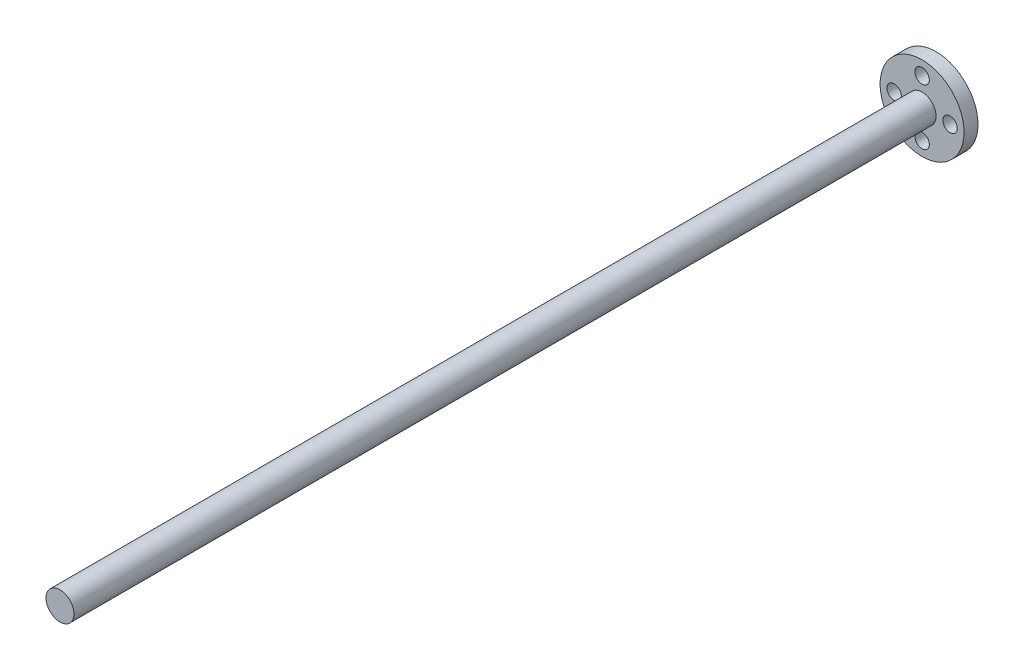
ISO-10303-21;
HEADER;
FILE_DESCRIPTION(('STEP AP214'),'2;1');
FILE_NAME('part.step','',(''),(''),'','','');
FILE_SCHEMA(('AUTOMOTIVE_DESIGN { 1 0 10303 214 1 1 1 1 }'));
ENDSEC;
DATA;
#1=APPLICATION_CONTEXT('core data for automotive mechanical design processes');
#2=APPLICATION_PROTOCOL_DEFINITION('international standard','automotive_design',2000,#1);
#3=PRODUCT_CONTEXT('',#1,'mechanical');
#4=PRODUCT('Part','Part','',(#3));
#5=PRODUCT_RELATED_PRODUCT_CATEGORY('part','',(#4));
#6=PRODUCT_DEFINITION_FORMATION('','',#4);
#7=PRODUCT_DEFINITION_CONTEXT('part definition',#1,'design');
#8=PRODUCT_DEFINITION('design','',#6,#7);
#9=PRODUCT_DEFINITION_SHAPE('','',#8);
#10=(LENGTH_UNIT() NAMED_UNIT(*) SI_UNIT(.MILLI.,.METRE.));
#11=(NAMED_UNIT(*) PLANE_ANGLE_UNIT() SI_UNIT($,.RADIAN.));
#12=(NAMED_UNIT(*) SI_UNIT($,.STERADIAN.) SOLID_ANGLE_UNIT());
#13=UNCERTAINTY_MEASURE_WITH_UNIT(LENGTH_MEASURE(1.E-05),#10,'distance_accuracy_value','');
#14=(GEOMETRIC_REPRESENTATION_CONTEXT(3) GLOBAL_UNCERTAINTY_ASSIGNED_CONTEXT((#13)) GLOBAL_UNIT_ASSIGNED_CONTEXT((#10,
#11,#12)) REPRESENTATION_CONTEXT('',''));
#15=CARTESIAN_POINT('',(0.,0.,0.));
#16=DIRECTION('',(0.,0.,1.));
#17=DIRECTION('',(1.,0.,0.));
#18=AXIS2_PLACEMENT_3D('',#15,#16,#17);
#19=CARTESIAN_POINT('',(0.,0.,3.));
#20=DIRECTION('',(0.,0.,1.));
#21=DIRECTION('',(1.,0.,0.));
#22=AXIS2_PLACEMENT_3D('',#19,#20,#21);
#23=PLANE('',#22);
#24=CARTESIAN_POINT('',(0.,0.,3.));
#25=DIRECTION('',(0.,0.,1.));
#26=DIRECTION('',(1.,0.,0.));
#27=AXIS2_PLACEMENT_3D('',#24,#25,#26);
#28=CIRCLE('',#27,3.);
#29=CARTESIAN_POINT('',(3.,0.,3.));
#30=VERTEX_POINT('',#29);
#31=EDGE_CURVE('E84',#30,#30,#28,.T.);
#32=ORIENTED_EDGE('',*,*,#31,.F.);
#33=EDGE_LOOP('',(#32));
#34=FACE_BOUND('',#33,.T.);
#35=CARTESIAN_POINT('',(6.,0.,3.));
#36=DIRECTION('',(0.,0.,1.));
#37=DIRECTION('',(1.,0.,0.));
#38=AXIS2_PLACEMENT_3D('',#35,#36,#37);
#39=CIRCLE('',#38,1.55);
#40=CARTESIAN_POINT('',(7.55,0.,3.));
#41=VERTEX_POINT('',#40);
#42=EDGE_CURVE('E64',#41,#41,#39,.T.);
#43=ORIENTED_EDGE('',*,*,#42,.F.);
#44=EDGE_LOOP('',(#43));
#45=FACE_BOUND('',#44,.T.);
#46=CARTESIAN_POINT('',(-6.,0.,3.));
#47=DIRECTION('',(0.,0.,1.));
#48=DIRECTION('',(1.,0.,0.));
#49=AXIS2_PLACEMENT_3D('',#46,#47,#48);
#50=CIRCLE('',#49,1.55);
#51=CARTESIAN_POINT('',(-4.45,0.,3.));
#52=VERTEX_POINT('',#51);
#53=EDGE_CURVE('E50',#52,#52,#50,.T.);
#54=ORIENTED_EDGE('',*,*,#53,.F.);
#55=EDGE_LOOP('',(#54));
#56=FACE_BOUND('',#55,.T.);
#57=CARTESIAN_POINT('',(0.,0.,3.));
#58=DIRECTION('',(0.,0.,1.));
#59=DIRECTION('',(1.,0.,0.));
#60=AXIS2_PLACEMENT_3D('',#57,#58,#59);
#61=CIRCLE('',#60,9.);
#62=CARTESIAN_POINT('',(9.,0.,3.));
#63=VERTEX_POINT('',#62);
#64=EDGE_CURVE('E10',#63,#63,#61,.T.);
#65=ORIENTED_EDGE('',*,*,#64,.T.);
#66=EDGE_LOOP('',(#65));
#67=FACE_BOUND('',#66,.T.);
#68=CARTESIAN_POINT('',(0.,6.,3.));
#69=DIRECTION('',(0.,0.,1.));
#70=DIRECTION('',(1.,0.,0.));
#71=AXIS2_PLACEMENT_3D('',#68,#69,#70);
#72=CIRCLE('',#71,1.55);
#73=CARTESIAN_POINT('',(1.55000000000002,6.,3.));
#74=VERTEX_POINT('',#73);
#75=EDGE_CURVE('E56',#74,#74,#72,.T.);
#76=ORIENTED_EDGE('',*,*,#75,.F.);
#77=EDGE_LOOP('',(#76));
#78=FACE_BOUND('',#77,.T.);
#79=CARTESIAN_POINT('',(0.,-6.,3.));
#80=DIRECTION('',(0.,0.,1.));
#81=DIRECTION('',(1.,0.,0.));
#82=AXIS2_PLACEMENT_3D('',#79,#80,#81);
#83=CIRCLE('',#82,1.55);
#84=CARTESIAN_POINT('',(1.54999999999994,-6.,3.));
#85=VERTEX_POINT('',#84);
#86=EDGE_CURVE('E72',#85,#85,#83,.T.);
#87=ORIENTED_EDGE('',*,*,#86,.F.);
#88=EDGE_LOOP('',(#87));
#89=FACE_BOUND('',#88,.T.);
#90=ADVANCED_FACE('F37',(#34,#45,#56,#67,#78,#89),#23,.T.);
#91=CARTESIAN_POINT('',(0.,0.,0.));
#92=DIRECTION('',(0.,0.,1.));
#93=DIRECTION('',(1.,0.,0.));
#94=AXIS2_PLACEMENT_3D('',#91,#92,#93);
#95=PLANE('',#94);
#96=CARTESIAN_POINT('',(0.,0.,0.));
#97=DIRECTION('',(0.,0.,1.));
#98=DIRECTION('',(1.,0.,0.));
#99=AXIS2_PLACEMENT_3D('',#96,#97,#98);
#100=CIRCLE('',#99,9.);
#101=CARTESIAN_POINT('',(9.,0.,0.));
#102=VERTEX_POINT('',#101);
#103=EDGE_CURVE('E41',#102,#102,#100,.T.);
#104=ORIENTED_EDGE('',*,*,#103,.F.);
#105=EDGE_LOOP('',(#104));
#106=FACE_BOUND('',#105,.T.);
#107=CARTESIAN_POINT('',(-6.,0.,0.));
#108=DIRECTION('',(0.,0.,1.));
#109=DIRECTION('',(1.,0.,0.));
#110=AXIS2_PLACEMENT_3D('',#107,#108,#109);
#111=CIRCLE('',#110,1.55);
#112=CARTESIAN_POINT('',(-4.45,0.,0.));
#113=VERTEX_POINT('',#112);
#114=EDGE_CURVE('E52',#113,#113,#111,.T.);
#115=ORIENTED_EDGE('',*,*,#114,.T.);
#116=EDGE_LOOP('',(#115));
#117=FACE_BOUND('',#116,.T.);
#118=CARTESIAN_POINT('',(0.,6.,0.));
#119=DIRECTION('',(0.,0.,1.));
#120=DIRECTION('',(1.,0.,0.));
#121=AXIS2_PLACEMENT_3D('',#118,#119,#120);
#122=CIRCLE('',#121,1.55);
#123=CARTESIAN_POINT('',(1.55000000000002,6.,0.));
#124=VERTEX_POINT('',#123);
#125=EDGE_CURVE('E60',#124,#124,#122,.T.);
#126=ORIENTED_EDGE('',*,*,#125,.T.);
#127=EDGE_LOOP('',(#126));
#128=FACE_BOUND('',#127,.T.);
#129=CARTESIAN_POINT('',(6.,0.,0.));
#130=DIRECTION('',(0.,0.,1.));
#131=DIRECTION('',(1.,0.,0.));
#132=AXIS2_PLACEMENT_3D('',#129,#130,#131);
#133=CIRCLE('',#132,1.55);
#134=CARTESIAN_POINT('',(7.55,0.,0.));
#135=VERTEX_POINT('',#134);
#136=EDGE_CURVE('E68',#135,#135,#133,.T.);
#137=ORIENTED_EDGE('',*,*,#136,.T.);
#138=EDGE_LOOP('',(#137));
#139=FACE_BOUND('',#138,.T.);
#140=CARTESIAN_POINT('',(0.,-6.,0.));
#141=DIRECTION('',(0.,0.,1.));
#142=DIRECTION('',(1.,0.,0.));
#143=AXIS2_PLACEMENT_3D('',#140,#141,#142);
#144=CIRCLE('',#143,1.55);
#145=CARTESIAN_POINT('',(1.54999999999994,-6.,0.));
#146=VERTEX_POINT('',#145);
#147=EDGE_CURVE('E76',#146,#146,#144,.T.);
#148=ORIENTED_EDGE('',*,*,#147,.T.);
#149=EDGE_LOOP('',(#148));
#150=FACE_BOUND('',#149,.T.);
#151=ADVANCED_FACE('F103',(#106,#117,#128,#139,#150),#95,.F.);
#152=CARTESIAN_POINT('',(0.,0.,3.));
#153=DIRECTION('',(0.,0.,-1.));
#154=DIRECTION('',(-1.,0.,0.));
#155=AXIS2_PLACEMENT_3D('',#152,#153,#154);
#156=CYLINDRICAL_SURFACE('',#155,9.);
#157=ORIENTED_EDGE('',*,*,#64,.F.);
#158=EDGE_LOOP('',(#157));
#159=FACE_BOUND('',#158,.T.);
#160=ORIENTED_EDGE('',*,*,#103,.T.);
#161=EDGE_LOOP('',(#160));
#162=FACE_BOUND('',#161,.T.);
#163=ADVANCED_FACE('F39',(#159,#162),#156,.T.);
#164=CARTESIAN_POINT('',(-6.,0.,3.));
#165=DIRECTION('',(0.,0.,-1.));
#166=DIRECTION('',(-1.,0.,0.));
#167=AXIS2_PLACEMENT_3D('',#164,#165,#166);
#168=CYLINDRICAL_SURFACE('',#167,1.55);
#169=ORIENTED_EDGE('',*,*,#53,.T.);
#170=EDGE_LOOP('',(#169));
#171=FACE_BOUND('',#170,.T.);
#172=ORIENTED_EDGE('',*,*,#114,.F.);
#173=EDGE_LOOP('',(#172));
#174=FACE_BOUND('',#173,.T.);
#175=ADVANCED_FACE('F124',(#171,#174),#168,.F.);
#176=CARTESIAN_POINT('',(0.,6.,3.));
#177=DIRECTION('',(0.,0.,-1.));
#178=DIRECTION('',(-1.,0.,0.));
#179=AXIS2_PLACEMENT_3D('',#176,#177,#178);
#180=CYLINDRICAL_SURFACE('',#179,1.55);
#181=ORIENTED_EDGE('',*,*,#75,.T.);
#182=EDGE_LOOP('',(#181));
#183=FACE_BOUND('',#182,.T.);
#184=ORIENTED_EDGE('',*,*,#125,.F.);
#185=EDGE_LOOP('',(#184));
#186=FACE_BOUND('',#185,.T.);
#187=ADVANCED_FACE('F131',(#183,#186),#180,.F.);
#188=CARTESIAN_POINT('',(6.,0.,3.));
#189=DIRECTION('',(0.,0.,-1.));
#190=DIRECTION('',(-1.,0.,0.));
#191=AXIS2_PLACEMENT_3D('',#188,#189,#190);
#192=CYLINDRICAL_SURFACE('',#191,1.55);
#193=ORIENTED_EDGE('',*,*,#42,.T.);
#194=EDGE_LOOP('',(#193));
#195=FACE_BOUND('',#194,.T.);
#196=ORIENTED_EDGE('',*,*,#136,.F.);
#197=EDGE_LOOP('',(#196));
#198=FACE_BOUND('',#197,.T.);
#199=ADVANCED_FACE('F115',(#195,#198),#192,.F.);
#200=CARTESIAN_POINT('',(0.,-6.,3.));
#201=DIRECTION('',(0.,0.,-1.));
#202=DIRECTION('',(-1.,0.,0.));
#203=AXIS2_PLACEMENT_3D('',#200,#201,#202);
#204=CYLINDRICAL_SURFACE('',#203,1.55);
#205=ORIENTED_EDGE('',*,*,#86,.T.);
#206=EDGE_LOOP('',(#205));
#207=FACE_BOUND('',#206,.T.);
#208=ORIENTED_EDGE('',*,*,#147,.F.);
#209=EDGE_LOOP('',(#208));
#210=FACE_BOUND('',#209,.T.);
#211=ADVANCED_FACE('F97',(#207,#210),#204,.F.);
#212=CARTESIAN_POINT('',(0.,0.,188.));
#213=DIRECTION('',(0.,0.,-1.));
#214=DIRECTION('',(-1.,0.,0.));
#215=AXIS2_PLACEMENT_3D('',#212,#213,#214);
#216=CYLINDRICAL_SURFACE('',#215,3.);
#217=CARTESIAN_POINT('',(0.,0.,188.));
#218=DIRECTION('',(0.,0.,1.));
#219=DIRECTION('',(1.,0.,0.));
#220=AXIS2_PLACEMENT_3D('',#217,#218,#219);
#221=CIRCLE('',#220,3.);
#222=CARTESIAN_POINT('',(3.,0.,188.));
#223=VERTEX_POINT('',#222);
#224=EDGE_CURVE('E80',#223,#223,#221,.T.);
#225=ORIENTED_EDGE('',*,*,#224,.F.);
#226=EDGE_LOOP('',(#225));
#227=FACE_BOUND('',#226,.T.);
#228=ORIENTED_EDGE('',*,*,#31,.T.);
#229=EDGE_LOOP('',(#228));
#230=FACE_BOUND('',#229,.T.);
#231=ADVANCED_FACE('F94',(#227,#230),#216,.T.);
#232=CARTESIAN_POINT('',(0.,0.,188.));
#233=DIRECTION('',(0.,0.,1.));
#234=DIRECTION('',(1.,0.,0.));
#235=AXIS2_PLACEMENT_3D('',#232,#233,#234);
#236=PLANE('',#235);
#237=ORIENTED_EDGE('',*,*,#224,.T.);
#238=EDGE_LOOP('',(#237));
#239=FACE_BOUND('',#238,.T.);
#240=ADVANCED_FACE('F92',(#239),#236,.T.);
#241=CLOSED_SHELL('',(#90,#151,#163,#175,#187,#199,#211,#231,#240));
#242=MANIFOLD_SOLID_BREP('B2',#241);
#243=ADVANCED_BREP_SHAPE_REPRESENTATION('',(#18,#242),#14);
#244=SHAPE_DEFINITION_REPRESENTATION(#9,#243);
ENDSEC;
END-ISO-10303-21;
